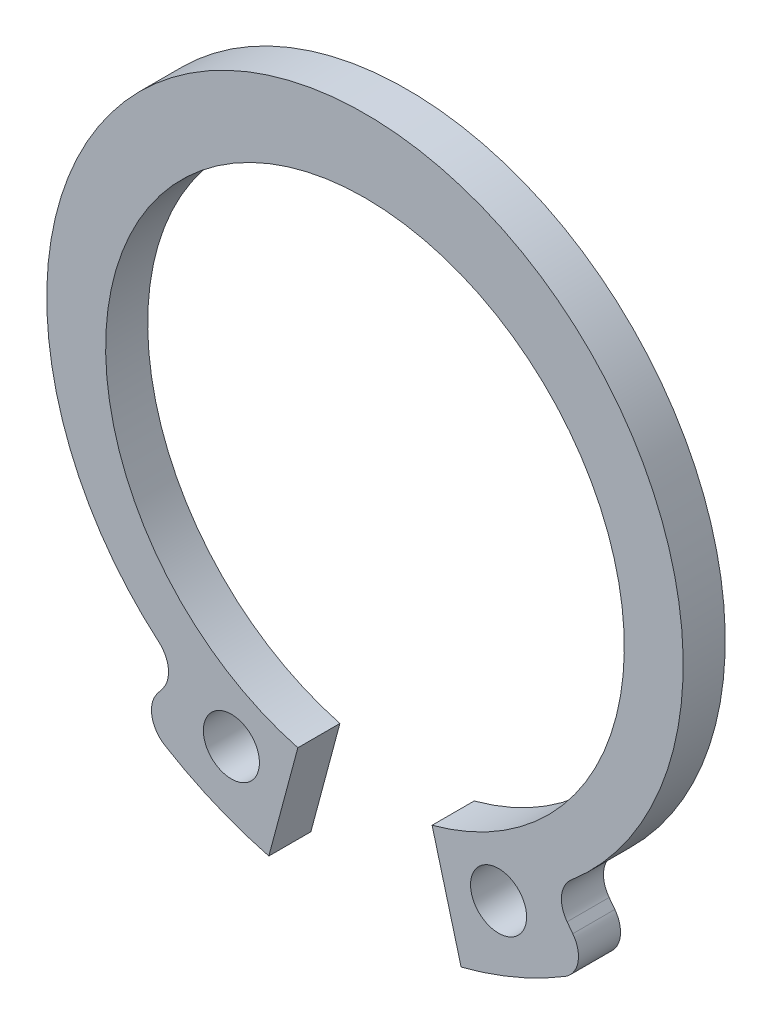
ISO-10303-21;
HEADER;
FILE_DESCRIPTION(('STEP AP214'),'2;1');
FILE_NAME('part.step','',(''),(''),'','','');
FILE_SCHEMA(('AUTOMOTIVE_DESIGN { 1 0 10303 214 1 1 1 1 }'));
ENDSEC;
DATA;
#1=APPLICATION_CONTEXT('core data for automotive mechanical design processes');
#2=APPLICATION_PROTOCOL_DEFINITION('international standard','automotive_design',2000,#1);
#3=PRODUCT_CONTEXT('',#1,'mechanical');
#4=PRODUCT('Part','Part','',(#3));
#5=PRODUCT_RELATED_PRODUCT_CATEGORY('part','',(#4));
#6=PRODUCT_DEFINITION_FORMATION('','',#4);
#7=PRODUCT_DEFINITION_CONTEXT('part definition',#1,'design');
#8=PRODUCT_DEFINITION('design','',#6,#7);
#9=PRODUCT_DEFINITION_SHAPE('','',#8);
#10=(LENGTH_UNIT() NAMED_UNIT(*) SI_UNIT(.MILLI.,.METRE.));
#11=(NAMED_UNIT(*) PLANE_ANGLE_UNIT() SI_UNIT($,.RADIAN.));
#12=(NAMED_UNIT(*) SI_UNIT($,.STERADIAN.) SOLID_ANGLE_UNIT());
#13=UNCERTAINTY_MEASURE_WITH_UNIT(LENGTH_MEASURE(1.E-05),#10,'distance_accuracy_value','');
#14=(GEOMETRIC_REPRESENTATION_CONTEXT(3) GLOBAL_UNCERTAINTY_ASSIGNED_CONTEXT((#13)) GLOBAL_UNIT_ASSIGNED_CONTEXT((#10,
#11,#12)) REPRESENTATION_CONTEXT('',''));
#15=CARTESIAN_POINT('',(0.,0.,0.));
#16=DIRECTION('',(0.,0.,1.));
#17=DIRECTION('',(1.,0.,0.));
#18=AXIS2_PLACEMENT_3D('',#15,#16,#17);
#19=CARTESIAN_POINT('',(-8.0058744410096,-8.90364155180261,1.50000000000001));
#20=DIRECTION('',(0.,0.,-1.));
#21=DIRECTION('',(-0.999999999999999,0.,0.));
#22=AXIS2_PLACEMENT_3D('',#19,#20,#21);
#23=PLANE('',#22);
#24=CARTESIAN_POINT('',(4.7645696632268,-10.0847293962178,1.49999999999997));
#25=DIRECTION('',(0.,0.,1.));
#26=DIRECTION('',(0.999999999999999,0.,0.));
#27=AXIS2_PLACEMENT_3D('',#24,#25,#26);
#28=CIRCLE('',#27,1.);
#29=CARTESIAN_POINT('',(5.7645696632268,-10.0847293962178,1.49999999999997));
#30=VERTEX_POINT('',#29);
#31=EDGE_CURVE('E139',#30,#30,#28,.T.);
#32=ORIENTED_EDGE('',*,*,#31,.F.);
#33=EDGE_LOOP('',(#32));
#34=FACE_BOUND('',#33,.T.);
#35=CARTESIAN_POINT('',(-8.0058744410096,-8.90364155180261,1.50000000000001));
#36=DIRECTION('',(0.,0.,-1.));
#37=DIRECTION('',(-0.999999999999999,0.,0.));
#38=AXIS2_PLACEMENT_3D('',#35,#36,#37);
#39=CIRCLE('',#38,1.);
#40=CARTESIAN_POINT('',(-7.35762549841774,-8.1422130860696,1.5));
#41=VERTEX_POINT('',#40);
#42=CARTESIAN_POINT('',(-7.20902970262182,-9.50782568176938,1.5));
#43=VERTEX_POINT('',#42);
#44=EDGE_CURVE('E165',#41,#43,#39,.T.);
#45=ORIENTED_EDGE('',*,*,#44,.T.);
#46=DIRECTION('',(-0.604184129966768,-0.796844738387785,0.));
#47=VECTOR('',#46,1.);
#48=CARTESIAN_POINT('',(-7.20902970262182,-9.50782568176938,1.5));
#49=LINE('',#48,#47);
#50=CARTESIAN_POINT('',(-7.41237351637155,-9.77601122328482,1.5));
#51=VERTEX_POINT('',#50);
#52=EDGE_CURVE('E134',#43,#51,#49,.T.);
#53=ORIENTED_EDGE('',*,*,#52,.T.);
#54=CARTESIAN_POINT('',(-6.61552877798376,-10.3801953532516,1.5));
#55=DIRECTION('',(0.,0.,1.));
#56=DIRECTION('',(-0.999999999999999,0.,0.));
#57=AXIS2_PLACEMENT_3D('',#54,#55,#56);
#58=CIRCLE('',#57,1.);
#59=CARTESIAN_POINT('',(-7.13506315925528,-11.2346448992617,1.5));
#60=VERTEX_POINT('',#59);
#61=EDGE_CURVE('E168',#51,#60,#58,.T.);
#62=ORIENTED_EDGE('',*,*,#61,.T.);
#63=CARTESIAN_POINT('',(0.,0.5,1.5));
#64=DIRECTION('',(0.,0.,1.));
#65=DIRECTION('',(0.999999999999999,0.,0.));
#66=AXIS2_PLACEMENT_3D('',#63,#64,#65);
#67=CIRCLE('',#66,13.7335726305405);
#68=CARTESIAN_POINT('',(-3.42935234760839,-12.7985171983301,1.50000000000003));
#69=VERTEX_POINT('',#68);
#70=EDGE_CURVE('E170',#60,#69,#67,.T.);
#71=ORIENTED_EDGE('',*,*,#70,.T.);
#72=DIRECTION('',(0.258819045102521,0.965925826289068,0.));
#73=VECTOR('',#72,1.);
#74=CARTESIAN_POINT('',(-2.39407616719831,-8.93481389317386,1.5));
#75=LINE('',#74,#73);
#76=CARTESIAN_POINT('',(-2.39407616719831,-8.93481389317386,1.5));
#77=VERTEX_POINT('',#76);
#78=EDGE_CURVE('E172',#69,#77,#75,.T.);
#79=ORIENTED_EDGE('',*,*,#78,.T.);
#80=CARTESIAN_POINT('',(0.,0.,1.5));
#81=DIRECTION('',(0.,0.,-1.));
#82=DIRECTION('',(0.999999999999999,0.,0.));
#83=AXIS2_PLACEMENT_3D('',#80,#81,#82);
#84=CIRCLE('',#83,9.25);
#85=CARTESIAN_POINT('',(2.39407616719832,-8.93481389317387,1.49999999999997));
#86=VERTEX_POINT('',#85);
#87=EDGE_CURVE('E174',#77,#86,#84,.T.);
#88=ORIENTED_EDGE('',*,*,#87,.T.);
#89=DIRECTION('',(0.258819045102521,-0.965925826289067,0.));
#90=VECTOR('',#89,1.);
#91=CARTESIAN_POINT('',(2.39407616719832,-8.93481389317387,1.49999999999997));
#92=LINE('',#91,#90);
#93=CARTESIAN_POINT('',(3.4293523476084,-12.7985171983301,1.49999999999999));
#94=VERTEX_POINT('',#93);
#95=EDGE_CURVE('E176',#86,#94,#92,.T.);
#96=ORIENTED_EDGE('',*,*,#95,.T.);
#97=CARTESIAN_POINT('',(0.,0.5,1.5));
#98=DIRECTION('',(0.,0.,1.));
#99=DIRECTION('',(0.999999999999999,0.,0.));
#100=AXIS2_PLACEMENT_3D('',#97,#98,#99);
#101=CIRCLE('',#100,13.7335726305405);
#102=CARTESIAN_POINT('',(7.13506315925528,-11.2346448992617,1.50000000000003));
#103=VERTEX_POINT('',#102);
#104=EDGE_CURVE('E178',#94,#103,#101,.T.);
#105=ORIENTED_EDGE('',*,*,#104,.T.);
#106=CARTESIAN_POINT('',(6.61552877798376,-10.3801953532516,1.50000000000004));
#107=DIRECTION('',(0.,0.,1.));
#108=DIRECTION('',(0.999999999999999,0.,0.));
#109=AXIS2_PLACEMENT_3D('',#106,#107,#108);
#110=CIRCLE('',#109,1.);
#111=CARTESIAN_POINT('',(7.41237351637155,-9.77601122328483,1.50000000000003));
#112=VERTEX_POINT('',#111);
#113=EDGE_CURVE('E180',#103,#112,#110,.T.);
#114=ORIENTED_EDGE('',*,*,#113,.T.);
#115=DIRECTION('',(-0.604184129966768,0.796844738387785,0.));
#116=VECTOR('',#115,1.);
#117=CARTESIAN_POINT('',(7.20902970262182,-9.50782568176938,1.50000000000003));
#118=LINE('',#117,#116);
#119=CARTESIAN_POINT('',(7.20902970262182,-9.50782568176938,1.50000000000003));
#120=VERTEX_POINT('',#119);
#121=EDGE_CURVE('E182',#112,#120,#118,.T.);
#122=ORIENTED_EDGE('',*,*,#121,.T.);
#123=CARTESIAN_POINT('',(8.00587444100961,-8.90364155180262,1.5));
#124=DIRECTION('',(0.,0.,-1.));
#125=DIRECTION('',(0.999999999999999,0.,0.));
#126=AXIS2_PLACEMENT_3D('',#123,#124,#125);
#127=CIRCLE('',#126,1.);
#128=CARTESIAN_POINT('',(7.35762549841773,-8.14221308606962,1.5));
#129=VERTEX_POINT('',#128);
#130=EDGE_CURVE('E51',#120,#129,#127,.T.);
#131=ORIENTED_EDGE('',*,*,#130,.T.);
#132=CARTESIAN_POINT('',(0.,0.5,1.5));
#133=DIRECTION('',(0.,0.,1.));
#134=DIRECTION('',(0.999999999999999,0.,0.));
#135=AXIS2_PLACEMENT_3D('',#132,#133,#134);
#136=CIRCLE('',#135,11.35);
#137=EDGE_CURVE('E46',#129,#41,#136,.T.);
#138=ORIENTED_EDGE('',*,*,#137,.T.);
#139=EDGE_LOOP('',(#45,#53,#62,#71,#79,#88,#96,#105,#114,#122,#131,#138));
#140=FACE_BOUND('',#139,.T.);
#141=CARTESIAN_POINT('',(-4.7645696632268,-10.0847293962178,1.5));
#142=DIRECTION('',(0.,0.,1.));
#143=DIRECTION('',(-0.999999999999999,0.,0.));
#144=AXIS2_PLACEMENT_3D('',#141,#142,#143);
#145=CIRCLE('',#144,1.);
#146=CARTESIAN_POINT('',(-5.7645696632268,-10.0847293962178,1.5));
#147=VERTEX_POINT('',#146);
#148=EDGE_CURVE('E285',#147,#147,#145,.T.);
#149=ORIENTED_EDGE('',*,*,#148,.F.);
#150=EDGE_LOOP('',(#149));
#151=FACE_BOUND('',#150,.T.);
#152=ADVANCED_FACE('F31',(#34,#140,#151),#23,.F.);
#153=CARTESIAN_POINT('',(-8.00587444100961,-8.90364155180261,0.));
#154=DIRECTION('',(0.,0.,-1.));
#155=DIRECTION('',(-0.999999999999999,0.,0.));
#156=AXIS2_PLACEMENT_3D('',#153,#154,#155);
#157=PLANE('',#156);
#158=CARTESIAN_POINT('',(4.7645696632268,-10.0847293962178,0.));
#159=DIRECTION('',(0.,0.,1.));
#160=DIRECTION('',(0.999999999999999,0.,0.));
#161=AXIS2_PLACEMENT_3D('',#158,#159,#160);
#162=CIRCLE('',#161,1.);
#163=CARTESIAN_POINT('',(5.7645696632268,-10.0847293962178,0.));
#164=VERTEX_POINT('',#163);
#165=EDGE_CURVE('E142',#164,#164,#162,.T.);
#166=ORIENTED_EDGE('',*,*,#165,.T.);
#167=EDGE_LOOP('',(#166));
#168=FACE_BOUND('',#167,.T.);
#169=CARTESIAN_POINT('',(-8.00587444100961,-8.90364155180261,0.));
#170=DIRECTION('',(0.,0.,-1.));
#171=DIRECTION('',(-0.999999999999999,0.,0.));
#172=AXIS2_PLACEMENT_3D('',#169,#170,#171);
#173=CIRCLE('',#172,1.);
#174=CARTESIAN_POINT('',(-7.35762549841775,-8.1422130860696,0.));
#175=VERTEX_POINT('',#174);
#176=CARTESIAN_POINT('',(-7.20902970262182,-9.50782568176937,0.));
#177=VERTEX_POINT('',#176);
#178=EDGE_CURVE('E125',#175,#177,#173,.T.);
#179=ORIENTED_EDGE('',*,*,#178,.F.);
#180=CARTESIAN_POINT('',(0.,0.5,0.));
#181=DIRECTION('',(0.,0.,1.));
#182=DIRECTION('',(0.999999999999999,0.,0.));
#183=AXIS2_PLACEMENT_3D('',#180,#181,#182);
#184=CIRCLE('',#183,11.35);
#185=CARTESIAN_POINT('',(7.35762549841773,-8.14221308606962,0.));
#186=VERTEX_POINT('',#185);
#187=EDGE_CURVE('E163',#186,#175,#184,.T.);
#188=ORIENTED_EDGE('',*,*,#187,.F.);
#189=CARTESIAN_POINT('',(8.00587444100962,-8.90364155180262,0.));
#190=DIRECTION('',(0.,0.,-1.));
#191=DIRECTION('',(0.999999999999999,0.,0.));
#192=AXIS2_PLACEMENT_3D('',#189,#190,#191);
#193=CIRCLE('',#192,1.);
#194=CARTESIAN_POINT('',(7.20902970262182,-9.50782568176938,0.));
#195=VERTEX_POINT('',#194);
#196=EDGE_CURVE('E161',#195,#186,#193,.T.);
#197=ORIENTED_EDGE('',*,*,#196,.F.);
#198=DIRECTION('',(-0.604184129966768,0.796844738387785,0.));
#199=VECTOR('',#198,1.);
#200=CARTESIAN_POINT('',(7.20902970262182,-9.50782568176938,0.));
#201=LINE('',#200,#199);
#202=CARTESIAN_POINT('',(7.41237351637155,-9.77601122328483,0.));
#203=VERTEX_POINT('',#202);
#204=EDGE_CURVE('E159',#203,#195,#201,.T.);
#205=ORIENTED_EDGE('',*,*,#204,.F.);
#206=CARTESIAN_POINT('',(6.61552877798376,-10.3801953532516,0.));
#207=DIRECTION('',(0.,0.,1.));
#208=DIRECTION('',(0.999999999999999,0.,0.));
#209=AXIS2_PLACEMENT_3D('',#206,#207,#208);
#210=CIRCLE('',#209,1.);
#211=CARTESIAN_POINT('',(7.13506315925528,-11.2346448992617,0.));
#212=VERTEX_POINT('',#211);
#213=EDGE_CURVE('E157',#212,#203,#210,.T.);
#214=ORIENTED_EDGE('',*,*,#213,.F.);
#215=CARTESIAN_POINT('',(0.,0.5,0.));
#216=DIRECTION('',(0.,0.,1.));
#217=DIRECTION('',(0.999999999999999,0.,0.));
#218=AXIS2_PLACEMENT_3D('',#215,#216,#217);
#219=CIRCLE('',#218,13.7335726305405);
#220=CARTESIAN_POINT('',(3.4293523476084,-12.7985171983301,0.));
#221=VERTEX_POINT('',#220);
#222=EDGE_CURVE('E155',#221,#212,#219,.T.);
#223=ORIENTED_EDGE('',*,*,#222,.F.);
#224=DIRECTION('',(0.258819045102521,-0.965925826289067,0.));
#225=VECTOR('',#224,1.);
#226=CARTESIAN_POINT('',(2.39407616719832,-8.93481389317387,0.));
#227=LINE('',#226,#225);
#228=CARTESIAN_POINT('',(2.39407616719832,-8.93481389317387,0.));
#229=VERTEX_POINT('',#228);
#230=EDGE_CURVE('E153',#229,#221,#227,.T.);
#231=ORIENTED_EDGE('',*,*,#230,.F.);
#232=CARTESIAN_POINT('',(0.,0.,0.));
#233=DIRECTION('',(0.,0.,-1.));
#234=DIRECTION('',(0.999999999999999,0.,0.));
#235=AXIS2_PLACEMENT_3D('',#232,#233,#234);
#236=CIRCLE('',#235,9.25);
#237=CARTESIAN_POINT('',(-2.39407616719831,-8.93481389317387,0.));
#238=VERTEX_POINT('',#237);
#239=EDGE_CURVE('E151',#238,#229,#236,.T.);
#240=ORIENTED_EDGE('',*,*,#239,.F.);
#241=DIRECTION('',(0.258819045102521,0.965925826289068,0.));
#242=VECTOR('',#241,1.);
#243=CARTESIAN_POINT('',(-2.39407616719832,-8.93481389317386,0.));
#244=LINE('',#243,#242);
#245=CARTESIAN_POINT('',(-3.4293523476084,-12.7985171983301,0.));
#246=VERTEX_POINT('',#245);
#247=EDGE_CURVE('E149',#246,#238,#244,.T.);
#248=ORIENTED_EDGE('',*,*,#247,.F.);
#249=CARTESIAN_POINT('',(0.,0.5,0.));
#250=DIRECTION('',(0.,0.,1.));
#251=DIRECTION('',(0.999999999999999,0.,0.));
#252=AXIS2_PLACEMENT_3D('',#249,#250,#251);
#253=CIRCLE('',#252,13.7335726305405);
#254=CARTESIAN_POINT('',(-7.13506315925529,-11.2346448992617,0.));
#255=VERTEX_POINT('',#254);
#256=EDGE_CURVE('E147',#255,#246,#253,.T.);
#257=ORIENTED_EDGE('',*,*,#256,.F.);
#258=CARTESIAN_POINT('',(-6.61552877798377,-10.3801953532516,0.));
#259=DIRECTION('',(0.,0.,1.));
#260=DIRECTION('',(-0.999999999999999,0.,0.));
#261=AXIS2_PLACEMENT_3D('',#258,#259,#260);
#262=CIRCLE('',#261,1.);
#263=CARTESIAN_POINT('',(-7.41237351637155,-9.77601122328482,0.));
#264=VERTEX_POINT('',#263);
#265=EDGE_CURVE('E127',#264,#255,#262,.T.);
#266=ORIENTED_EDGE('',*,*,#265,.F.);
#267=DIRECTION('',(-0.604184129966768,-0.796844738387785,0.));
#268=VECTOR('',#267,1.);
#269=CARTESIAN_POINT('',(-7.20902970262182,-9.50782568176937,0.));
#270=LINE('',#269,#268);
#271=EDGE_CURVE('E120',#177,#264,#270,.T.);
#272=ORIENTED_EDGE('',*,*,#271,.F.);
#273=EDGE_LOOP('',(#179,#188,#197,#205,#214,#223,#231,#240,#248,#257,#266,#272));
#274=FACE_BOUND('',#273,.T.);
#275=CARTESIAN_POINT('',(-4.7645696632268,-10.0847293962178,0.));
#276=DIRECTION('',(0.,0.,1.));
#277=DIRECTION('',(-0.999999999999999,0.,0.));
#278=AXIS2_PLACEMENT_3D('',#275,#276,#277);
#279=CIRCLE('',#278,1.);
#280=CARTESIAN_POINT('',(-5.7645696632268,-10.0847293962178,0.));
#281=VERTEX_POINT('',#280);
#282=EDGE_CURVE('E288',#281,#281,#279,.T.);
#283=ORIENTED_EDGE('',*,*,#282,.T.);
#284=EDGE_LOOP('',(#283));
#285=FACE_BOUND('',#284,.T.);
#286=ADVANCED_FACE('F121',(#168,#274,#285),#157,.T.);
#287=CARTESIAN_POINT('',(-8.0058744410096,-8.90364155180261,1.50000000000001));
#288=DIRECTION('',(0.,0.,-1.));
#289=DIRECTION('',(-0.999999999999999,0.,0.));
#290=AXIS2_PLACEMENT_3D('',#287,#288,#289);
#291=CYLINDRICAL_SURFACE('',#290,1.);
#292=ORIENTED_EDGE('',*,*,#178,.T.);
#293=DIRECTION('',(0.,0.,-1.));
#294=VECTOR('',#293,1.);
#295=CARTESIAN_POINT('',(-7.20902970262182,-9.50782568176938,1.5));
#296=LINE('',#295,#294);
#297=EDGE_CURVE('E11',#43,#177,#296,.T.);
#298=ORIENTED_EDGE('',*,*,#297,.F.);
#299=ORIENTED_EDGE('',*,*,#44,.F.);
#300=DIRECTION('',(0.,0.,-1.));
#301=VECTOR('',#300,1.);
#302=CARTESIAN_POINT('',(-7.35762549841774,-8.1422130860696,1.5));
#303=LINE('',#302,#301);
#304=EDGE_CURVE('E138',#41,#175,#303,.T.);
#305=ORIENTED_EDGE('',*,*,#304,.T.);
#306=EDGE_LOOP('',(#292,#298,#299,#305));
#307=FACE_BOUND('',#306,.T.);
#308=ADVANCED_FACE('F33',(#307),#291,.F.);
#309=CARTESIAN_POINT('',(-7.20902970262182,-9.50782568176938,1.5));
#310=DIRECTION('',(0.796844738387785,-0.604184129966768,0.));
#311=DIRECTION('',(0.604184129966768,0.796844738387785,0.));
#312=AXIS2_PLACEMENT_3D('',#309,#310,#311);
#313=PLANE('',#312);
#314=ORIENTED_EDGE('',*,*,#271,.T.);
#315=DIRECTION('',(0.,0.,-1.));
#316=VECTOR('',#315,1.);
#317=CARTESIAN_POINT('',(-7.41237351637155,-9.77601122328482,1.5));
#318=LINE('',#317,#316);
#319=EDGE_CURVE('E39',#51,#264,#318,.T.);
#320=ORIENTED_EDGE('',*,*,#319,.F.);
#321=ORIENTED_EDGE('',*,*,#52,.F.);
#322=ORIENTED_EDGE('',*,*,#297,.T.);
#323=EDGE_LOOP('',(#314,#320,#321,#322));
#324=FACE_BOUND('',#323,.T.);
#325=ADVANCED_FACE('F133',(#324),#313,.F.);
#326=CARTESIAN_POINT('',(-6.61552877798376,-10.3801953532516,1.5));
#327=DIRECTION('',(0.,0.,-1.));
#328=DIRECTION('',(-0.999999999999999,0.,0.));
#329=AXIS2_PLACEMENT_3D('',#326,#327,#328);
#330=CYLINDRICAL_SURFACE('',#329,1.);
#331=ORIENTED_EDGE('',*,*,#265,.T.);
#332=DIRECTION('',(0.,0.,-1.));
#333=VECTOR('',#332,1.);
#334=CARTESIAN_POINT('',(-7.13506315925528,-11.2346448992617,1.5));
#335=LINE('',#334,#333);
#336=EDGE_CURVE('E211',#60,#255,#335,.T.);
#337=ORIENTED_EDGE('',*,*,#336,.F.);
#338=ORIENTED_EDGE('',*,*,#61,.F.);
#339=ORIENTED_EDGE('',*,*,#319,.T.);
#340=EDGE_LOOP('',(#331,#337,#338,#339));
#341=FACE_BOUND('',#340,.T.);
#342=ADVANCED_FACE('F215',(#341),#330,.T.);
#343=CARTESIAN_POINT('',(0.,0.5,1.5));
#344=DIRECTION('',(0.,0.,-1.));
#345=DIRECTION('',(-0.999999999999999,0.,0.));
#346=AXIS2_PLACEMENT_3D('',#343,#344,#345);
#347=CYLINDRICAL_SURFACE('',#346,13.7335726305405);
#348=ORIENTED_EDGE('',*,*,#256,.T.);
#349=DIRECTION('',(0.,0.,-1.));
#350=VECTOR('',#349,1.);
#351=CARTESIAN_POINT('',(-3.42935234760839,-12.7985171983301,1.50000000000003));
#352=LINE('',#351,#350);
#353=EDGE_CURVE('E208',#69,#246,#352,.T.);
#354=ORIENTED_EDGE('',*,*,#353,.F.);
#355=ORIENTED_EDGE('',*,*,#70,.F.);
#356=ORIENTED_EDGE('',*,*,#336,.T.);
#357=EDGE_LOOP('',(#348,#354,#355,#356));
#358=FACE_BOUND('',#357,.T.);
#359=ADVANCED_FACE('F223',(#358),#347,.T.);
#360=CARTESIAN_POINT('',(-2.39407616719831,-8.93481389317386,1.5));
#361=DIRECTION('',(-0.965925826289067,0.258819045102521,0.));
#362=DIRECTION('',(-0.258819045102521,-0.965925826289068,0.));
#363=AXIS2_PLACEMENT_3D('',#360,#361,#362);
#364=PLANE('',#363);
#365=ORIENTED_EDGE('',*,*,#247,.T.);
#366=DIRECTION('',(0.,0.,-1.));
#367=VECTOR('',#366,1.);
#368=CARTESIAN_POINT('',(-2.39407616719831,-8.93481389317386,1.5));
#369=LINE('',#368,#367);
#370=EDGE_CURVE('E205',#77,#238,#369,.T.);
#371=ORIENTED_EDGE('',*,*,#370,.F.);
#372=ORIENTED_EDGE('',*,*,#78,.F.);
#373=ORIENTED_EDGE('',*,*,#353,.T.);
#374=EDGE_LOOP('',(#365,#371,#372,#373));
#375=FACE_BOUND('',#374,.T.);
#376=ADVANCED_FACE('F226',(#375),#364,.F.);
#377=CARTESIAN_POINT('',(0.,0.,1.5));
#378=DIRECTION('',(0.,0.,-1.));
#379=DIRECTION('',(-0.999999999999999,0.,0.));
#380=AXIS2_PLACEMENT_3D('',#377,#378,#379);
#381=CYLINDRICAL_SURFACE('',#380,9.25);
#382=ORIENTED_EDGE('',*,*,#239,.T.);
#383=DIRECTION('',(0.,0.,-1.));
#384=VECTOR('',#383,1.);
#385=CARTESIAN_POINT('',(2.39407616719832,-8.93481389317387,1.49999999999997));
#386=LINE('',#385,#384);
#387=EDGE_CURVE('E202',#86,#229,#386,.T.);
#388=ORIENTED_EDGE('',*,*,#387,.F.);
#389=ORIENTED_EDGE('',*,*,#87,.F.);
#390=ORIENTED_EDGE('',*,*,#370,.T.);
#391=EDGE_LOOP('',(#382,#388,#389,#390));
#392=FACE_BOUND('',#391,.T.);
#393=ADVANCED_FACE('F231',(#392),#381,.F.);
#394=CARTESIAN_POINT('',(2.39407616719832,-8.93481389317387,1.49999999999997));
#395=DIRECTION('',(0.965925826289067,0.258819045102521,0.));
#396=DIRECTION('',(-0.258819045102521,0.965925826289067,0.));
#397=AXIS2_PLACEMENT_3D('',#394,#395,#396);
#398=PLANE('',#397);
#399=ORIENTED_EDGE('',*,*,#230,.T.);
#400=DIRECTION('',(0.,0.,-1.));
#401=VECTOR('',#400,1.);
#402=CARTESIAN_POINT('',(3.4293523476084,-12.7985171983301,1.49999999999999));
#403=LINE('',#402,#401);
#404=EDGE_CURVE('E199',#94,#221,#403,.T.);
#405=ORIENTED_EDGE('',*,*,#404,.F.);
#406=ORIENTED_EDGE('',*,*,#95,.F.);
#407=ORIENTED_EDGE('',*,*,#387,.T.);
#408=EDGE_LOOP('',(#399,#405,#406,#407));
#409=FACE_BOUND('',#408,.T.);
#410=ADVANCED_FACE('F237',(#409),#398,.F.);
#411=CARTESIAN_POINT('',(0.,0.5,1.5));
#412=DIRECTION('',(0.,0.,-1.));
#413=DIRECTION('',(-0.999999999999999,0.,0.));
#414=AXIS2_PLACEMENT_3D('',#411,#412,#413);
#415=CYLINDRICAL_SURFACE('',#414,13.7335726305405);
#416=ORIENTED_EDGE('',*,*,#222,.T.);
#417=DIRECTION('',(0.,0.,-1.));
#418=VECTOR('',#417,1.);
#419=CARTESIAN_POINT('',(7.13506315925528,-11.2346448992617,1.50000000000003));
#420=LINE('',#419,#418);
#421=EDGE_CURVE('E196',#103,#212,#420,.T.);
#422=ORIENTED_EDGE('',*,*,#421,.F.);
#423=ORIENTED_EDGE('',*,*,#104,.F.);
#424=ORIENTED_EDGE('',*,*,#404,.T.);
#425=EDGE_LOOP('',(#416,#422,#423,#424));
#426=FACE_BOUND('',#425,.T.);
#427=ADVANCED_FACE('F241',(#426),#415,.T.);
#428=CARTESIAN_POINT('',(6.61552877798376,-10.3801953532516,1.50000000000004));
#429=DIRECTION('',(0.,0.,-1.));
#430=DIRECTION('',(-0.999999999999999,0.,0.));
#431=AXIS2_PLACEMENT_3D('',#428,#429,#430);
#432=CYLINDRICAL_SURFACE('',#431,1.);
#433=ORIENTED_EDGE('',*,*,#213,.T.);
#434=DIRECTION('',(0.,0.,-1.));
#435=VECTOR('',#434,1.);
#436=CARTESIAN_POINT('',(7.41237351637155,-9.77601122328483,1.50000000000003));
#437=LINE('',#436,#435);
#438=EDGE_CURVE('E193',#112,#203,#437,.T.);
#439=ORIENTED_EDGE('',*,*,#438,.F.);
#440=ORIENTED_EDGE('',*,*,#113,.F.);
#441=ORIENTED_EDGE('',*,*,#421,.T.);
#442=EDGE_LOOP('',(#433,#439,#440,#441));
#443=FACE_BOUND('',#442,.T.);
#444=ADVANCED_FACE('F246',(#443),#432,.T.);
#445=CARTESIAN_POINT('',(7.20902970262182,-9.50782568176938,1.50000000000003));
#446=DIRECTION('',(-0.796844738387785,-0.604184129966768,0.));
#447=DIRECTION('',(0.604184129966768,-0.796844738387785,0.));
#448=AXIS2_PLACEMENT_3D('',#445,#446,#447);
#449=PLANE('',#448);
#450=ORIENTED_EDGE('',*,*,#204,.T.);
#451=DIRECTION('',(0.,0.,-1.));
#452=VECTOR('',#451,1.);
#453=CARTESIAN_POINT('',(7.20902970262182,-9.50782568176938,1.50000000000003));
#454=LINE('',#453,#452);
#455=EDGE_CURVE('E190',#120,#195,#454,.T.);
#456=ORIENTED_EDGE('',*,*,#455,.F.);
#457=ORIENTED_EDGE('',*,*,#121,.F.);
#458=ORIENTED_EDGE('',*,*,#438,.T.);
#459=EDGE_LOOP('',(#450,#456,#457,#458));
#460=FACE_BOUND('',#459,.T.);
#461=ADVANCED_FACE('F250',(#460),#449,.F.);
#462=CARTESIAN_POINT('',(8.00587444100961,-8.90364155180262,1.5));
#463=DIRECTION('',(0.,0.,-1.));
#464=DIRECTION('',(-0.999999999999999,0.,0.));
#465=AXIS2_PLACEMENT_3D('',#462,#463,#464);
#466=CYLINDRICAL_SURFACE('',#465,1.);
#467=ORIENTED_EDGE('',*,*,#196,.T.);
#468=DIRECTION('',(0.,0.,-1.));
#469=VECTOR('',#468,1.);
#470=CARTESIAN_POINT('',(7.35762549841773,-8.14221308606962,1.5));
#471=LINE('',#470,#469);
#472=EDGE_CURVE('E187',#129,#186,#471,.T.);
#473=ORIENTED_EDGE('',*,*,#472,.F.);
#474=ORIENTED_EDGE('',*,*,#130,.F.);
#475=ORIENTED_EDGE('',*,*,#455,.T.);
#476=EDGE_LOOP('',(#467,#473,#474,#475));
#477=FACE_BOUND('',#476,.T.);
#478=ADVANCED_FACE('F254',(#477),#466,.F.);
#479=CARTESIAN_POINT('',(0.,0.5,1.5));
#480=DIRECTION('',(0.,0.,-1.));
#481=DIRECTION('',(-0.999999999999999,0.,0.));
#482=AXIS2_PLACEMENT_3D('',#479,#480,#481);
#483=CYLINDRICAL_SURFACE('',#482,11.35);
#484=ORIENTED_EDGE('',*,*,#187,.T.);
#485=ORIENTED_EDGE('',*,*,#304,.F.);
#486=ORIENTED_EDGE('',*,*,#137,.F.);
#487=ORIENTED_EDGE('',*,*,#472,.T.);
#488=EDGE_LOOP('',(#484,#485,#486,#487));
#489=FACE_BOUND('',#488,.T.);
#490=ADVANCED_FACE('F256',(#489),#483,.T.);
#491=CARTESIAN_POINT('',(4.7645696632268,-10.0847293962178,1.49999999999997));
#492=DIRECTION('',(0.,0.,-1.));
#493=DIRECTION('',(-0.999999999999999,0.,0.));
#494=AXIS2_PLACEMENT_3D('',#491,#492,#493);
#495=CYLINDRICAL_SURFACE('',#494,1.);
#496=ORIENTED_EDGE('',*,*,#31,.T.);
#497=EDGE_LOOP('',(#496));
#498=FACE_BOUND('',#497,.T.);
#499=ORIENTED_EDGE('',*,*,#165,.F.);
#500=EDGE_LOOP('',(#499));
#501=FACE_BOUND('',#500,.T.);
#502=ADVANCED_FACE('F258',(#498,#501),#495,.F.);
#503=CARTESIAN_POINT('',(-4.7645696632268,-10.0847293962178,1.5));
#504=DIRECTION('',(0.,0.,-1.));
#505=DIRECTION('',(-0.999999999999999,0.,0.));
#506=AXIS2_PLACEMENT_3D('',#503,#504,#505);
#507=CYLINDRICAL_SURFACE('',#506,1.);
#508=ORIENTED_EDGE('',*,*,#148,.T.);
#509=EDGE_LOOP('',(#508));
#510=FACE_BOUND('',#509,.T.);
#511=ORIENTED_EDGE('',*,*,#282,.F.);
#512=EDGE_LOOP('',(#511));
#513=FACE_BOUND('',#512,.T.);
#514=ADVANCED_FACE('F264',(#510,#513),#507,.F.);
#515=CLOSED_SHELL('',(#152,#286,#308,#325,#342,#359,#376,#393,#410,#427,#444,#461,#478,#490,
#502,#514));
#516=MANIFOLD_SOLID_BREP('B2',#515);
#517=ADVANCED_BREP_SHAPE_REPRESENTATION('',(#18,#516),#14);
#518=SHAPE_DEFINITION_REPRESENTATION(#9,#517);
ENDSEC;
END-ISO-10303-21;
